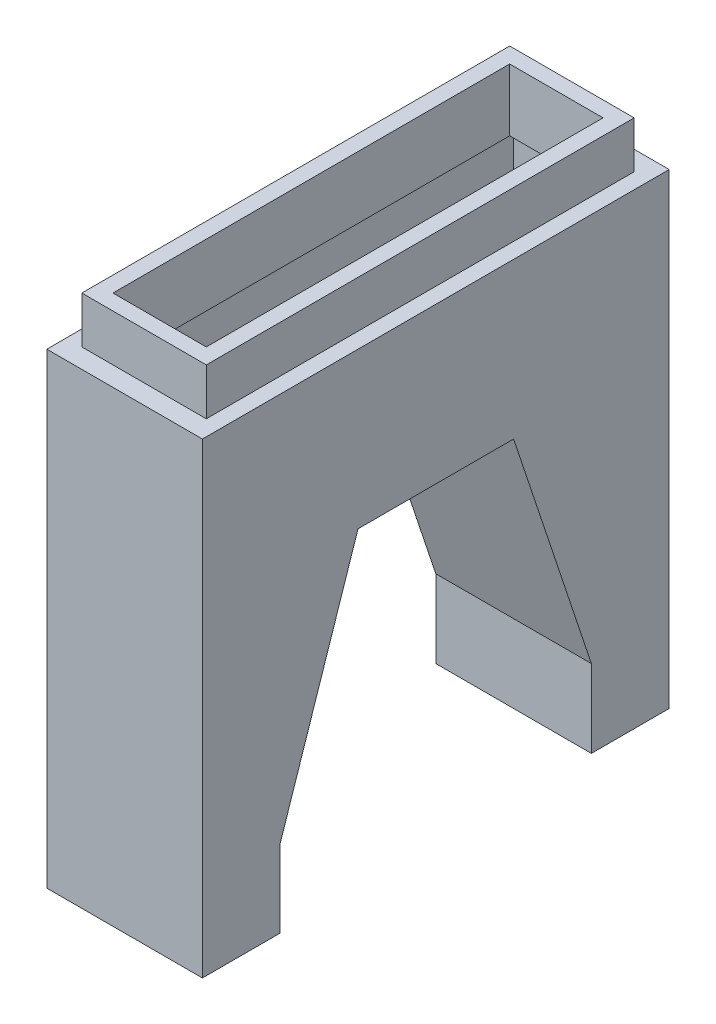
ISO-10303-21;
HEADER;
FILE_DESCRIPTION(('STEP AP214'),'2;1');
FILE_NAME('part.step','',(''),(''),'','','');
FILE_SCHEMA(('AUTOMOTIVE_DESIGN { 1 0 10303 214 1 1 1 1 }'));
ENDSEC;
DATA;
#1=APPLICATION_CONTEXT('core data for automotive mechanical design processes');
#2=APPLICATION_PROTOCOL_DEFINITION('international standard','automotive_design',2000,#1);
#3=PRODUCT_CONTEXT('',#1,'mechanical');
#4=PRODUCT('Part','Part','',(#3));
#5=PRODUCT_RELATED_PRODUCT_CATEGORY('part','',(#4));
#6=PRODUCT_DEFINITION_FORMATION('','',#4);
#7=PRODUCT_DEFINITION_CONTEXT('part definition',#1,'design');
#8=PRODUCT_DEFINITION('design','',#6,#7);
#9=PRODUCT_DEFINITION_SHAPE('','',#8);
#10=(LENGTH_UNIT() NAMED_UNIT(*) SI_UNIT(.MILLI.,.METRE.));
#11=(NAMED_UNIT(*) PLANE_ANGLE_UNIT() SI_UNIT($,.RADIAN.));
#12=(NAMED_UNIT(*) SI_UNIT($,.STERADIAN.) SOLID_ANGLE_UNIT());
#13=UNCERTAINTY_MEASURE_WITH_UNIT(LENGTH_MEASURE(1.E-05),#10,'distance_accuracy_value','');
#14=(GEOMETRIC_REPRESENTATION_CONTEXT(3) GLOBAL_UNCERTAINTY_ASSIGNED_CONTEXT((#13)) GLOBAL_UNIT_ASSIGNED_CONTEXT((#10,
#11,#12)) REPRESENTATION_CONTEXT('',''));
#15=CARTESIAN_POINT('',(0.,0.,0.));
#16=DIRECTION('',(0.,0.,1.));
#17=DIRECTION('',(1.,0.,0.));
#18=AXIS2_PLACEMENT_3D('',#15,#16,#17);
#19=CARTESIAN_POINT('',(0.,3.,0.));
#20=DIRECTION('',(0.,-1.,0.));
#21=DIRECTION('',(0.,0.,-1.));
#22=AXIS2_PLACEMENT_3D('',#19,#20,#21);
#23=PLANE('',#22);
#24=DIRECTION('',(0.,0.,-1.));
#25=VECTOR('',#24,1.);
#26=CARTESIAN_POINT('',(4.,3.,13.75));
#27=LINE('',#26,#25);
#28=CARTESIAN_POINT('',(4.,3.,13.75));
#29=VERTEX_POINT('',#28);
#30=CARTESIAN_POINT('',(4.,3.,-13.75));
#31=VERTEX_POINT('',#30);
#32=EDGE_CURVE('E453',#29,#31,#27,.T.);
#33=ORIENTED_EDGE('',*,*,#32,.T.);
#34=DIRECTION('',(-1.,0.,0.));
#35=VECTOR('',#34,1.);
#36=CARTESIAN_POINT('',(-4.,3.,-13.75));
#37=LINE('',#36,#35);
#38=CARTESIAN_POINT('',(-4.,3.,-13.75));
#39=VERTEX_POINT('',#38);
#40=EDGE_CURVE('E456',#31,#39,#37,.T.);
#41=ORIENTED_EDGE('',*,*,#40,.T.);
#42=DIRECTION('',(0.,0.,1.));
#43=VECTOR('',#42,1.);
#44=CARTESIAN_POINT('',(-4.,3.,13.75));
#45=LINE('',#44,#43);
#46=CARTESIAN_POINT('',(-4.,3.,13.75));
#47=VERTEX_POINT('',#46);
#48=EDGE_CURVE('E459',#39,#47,#45,.T.);
#49=ORIENTED_EDGE('',*,*,#48,.T.);
#50=DIRECTION('',(1.,0.,0.));
#51=VECTOR('',#50,1.);
#52=CARTESIAN_POINT('',(-4.,3.,13.75));
#53=LINE('',#52,#51);
#54=EDGE_CURVE('E461',#47,#29,#53,.T.);
#55=ORIENTED_EDGE('',*,*,#54,.T.);
#56=EDGE_LOOP('',(#33,#41,#49,#55));
#57=FACE_BOUND('',#56,.T.);
#58=DIRECTION('',(0.,0.,-1.));
#59=VECTOR('',#58,1.);
#60=CARTESIAN_POINT('',(3.,3.,0.));
#61=LINE('',#60,#59);
#62=CARTESIAN_POINT('',(3.,3.,12.75));
#63=VERTEX_POINT('',#62);
#64=CARTESIAN_POINT('',(3.,3.,-12.75));
#65=VERTEX_POINT('',#64);
#66=EDGE_CURVE('E333',#63,#65,#61,.T.);
#67=ORIENTED_EDGE('',*,*,#66,.F.);
#68=DIRECTION('',(1.,0.,0.));
#69=VECTOR('',#68,1.);
#70=CARTESIAN_POINT('',(0.,3.,12.75));
#71=LINE('',#70,#69);
#72=CARTESIAN_POINT('',(-3.,3.,12.75));
#73=VERTEX_POINT('',#72);
#74=EDGE_CURVE('E347',#73,#63,#71,.T.);
#75=ORIENTED_EDGE('',*,*,#74,.F.);
#76=DIRECTION('',(0.,0.,1.));
#77=VECTOR('',#76,1.);
#78=CARTESIAN_POINT('',(-3.,3.,0.));
#79=LINE('',#78,#77);
#80=CARTESIAN_POINT('',(-3.,3.,-12.75));
#81=VERTEX_POINT('',#80);
#82=EDGE_CURVE('E372',#81,#73,#79,.T.);
#83=ORIENTED_EDGE('',*,*,#82,.F.);
#84=DIRECTION('',(-1.,0.,0.));
#85=VECTOR('',#84,1.);
#86=CARTESIAN_POINT('',(0.,3.,-12.75));
#87=LINE('',#86,#85);
#88=EDGE_CURVE('E370',#65,#81,#87,.T.);
#89=ORIENTED_EDGE('',*,*,#88,.F.);
#90=EDGE_LOOP('',(#67,#75,#83,#89));
#91=FACE_BOUND('',#90,.T.);
#92=ADVANCED_FACE('F33',(#57,#91),#23,.F.);
#93=CARTESIAN_POINT('',(-1.,-30.,12.));
#94=DIRECTION('',(1.,0.,0.));
#95=DIRECTION('',(0.,0.,-1.));
#96=AXIS2_PLACEMENT_3D('',#93,#94,#95);
#97=PLANE('',#96);
#98=DIRECTION('',(0.,-1.,0.));
#99=VECTOR('',#98,1.);
#100=CARTESIAN_POINT('',(-1.,-30.,11.));
#101=LINE('',#100,#99);
#102=CARTESIAN_POINT('',(-1.,-24.9999999999998,11.));
#103=VERTEX_POINT('',#102);
#104=CARTESIAN_POINT('',(-1.,-29.,11.));
#105=VERTEX_POINT('',#104);
#106=EDGE_CURVE('E11',#103,#105,#101,.T.);
#107=ORIENTED_EDGE('',*,*,#106,.F.);
#108=DIRECTION('',(0.,0.,-1.));
#109=VECTOR('',#108,1.);
#110=CARTESIAN_POINT('',(-1.,-24.9999999999998,12.));
#111=LINE('',#110,#109);
#112=CARTESIAN_POINT('',(-1.,-24.9999999999998,10.));
#113=VERTEX_POINT('',#112);
#114=EDGE_CURVE('E392',#103,#113,#111,.T.);
#115=ORIENTED_EDGE('',*,*,#114,.T.);
#116=DIRECTION('',(0.,-1.,0.));
#117=VECTOR('',#116,1.);
#118=CARTESIAN_POINT('',(-1.,-30.,10.));
#119=LINE('',#118,#117);
#120=CARTESIAN_POINT('',(-1.,-30.,10.));
#121=VERTEX_POINT('',#120);
#122=EDGE_CURVE('E368',#113,#121,#119,.T.);
#123=ORIENTED_EDGE('',*,*,#122,.T.);
#124=DIRECTION('',(0.,0.,-1.));
#125=VECTOR('',#124,1.);
#126=CARTESIAN_POINT('',(-1.,-30.,12.));
#127=LINE('',#126,#125);
#128=CARTESIAN_POINT('',(-1.,-30.,12.));
#129=VERTEX_POINT('',#128);
#130=EDGE_CURVE('E387',#129,#121,#127,.T.);
#131=ORIENTED_EDGE('',*,*,#130,.F.);
#132=DIRECTION('',(0.,-1.,0.));
#133=VECTOR('',#132,1.);
#134=CARTESIAN_POINT('',(-1.,-30.,12.));
#135=LINE('',#134,#133);
#136=CARTESIAN_POINT('',(-1.,-29.,12.));
#137=VERTEX_POINT('',#136);
#138=EDGE_CURVE('E381',#137,#129,#135,.T.);
#139=ORIENTED_EDGE('',*,*,#138,.F.);
#140=DIRECTION('',(0.,0.,-1.));
#141=VECTOR('',#140,1.);
#142=CARTESIAN_POINT('',(-1.,-29.,0.));
#143=LINE('',#142,#141);
#144=EDGE_CURVE('E58',#137,#105,#143,.T.);
#145=ORIENTED_EDGE('',*,*,#144,.T.);
#146=EDGE_LOOP('',(#107,#115,#123,#131,#139,#145));
#147=FACE_BOUND('',#146,.T.);
#148=ADVANCED_FACE('F527',(#147),#97,.F.);
#149=CARTESIAN_POINT('',(-5.,-24.9999999999998,12.));
#150=DIRECTION('',(0.,1.,0.));
#151=DIRECTION('',(0.,0.,1.));
#152=AXIS2_PLACEMENT_3D('',#149,#150,#151);
#153=PLANE('',#152);
#154=DIRECTION('',(1.,0.,0.));
#155=VECTOR('',#154,1.);
#156=CARTESIAN_POINT('',(-5.,-24.9999999999998,11.0540925533895));
#157=LINE('',#156,#155);
#158=CARTESIAN_POINT('',(-4.,-24.9999999999998,11.0540925533895));
#159=VERTEX_POINT('',#158);
#160=CARTESIAN_POINT('',(-1.,-24.9999999999998,11.0540925533895));
#161=VERTEX_POINT('',#160);
#162=EDGE_CURVE('E282',#159,#161,#157,.T.);
#163=ORIENTED_EDGE('',*,*,#162,.F.);
#164=DIRECTION('',(0.,0.,-1.));
#165=VECTOR('',#164,1.);
#166=CARTESIAN_POINT('',(-4.,-24.9999999999998,12.));
#167=LINE('',#166,#165);
#168=CARTESIAN_POINT('',(-4.,-24.9999999999998,12.));
#169=VERTEX_POINT('',#168);
#170=EDGE_CURVE('E356',#169,#159,#167,.T.);
#171=ORIENTED_EDGE('',*,*,#170,.F.);
#172=DIRECTION('',(1.,0.,0.));
#173=VECTOR('',#172,1.);
#174=CARTESIAN_POINT('',(-5.,-24.9999999999998,12.));
#175=LINE('',#174,#173);
#176=CARTESIAN_POINT('',(-5.,-24.9999999999998,12.));
#177=VERTEX_POINT('',#176);
#178=EDGE_CURVE('E378',#177,#169,#175,.T.);
#179=ORIENTED_EDGE('',*,*,#178,.F.);
#180=DIRECTION('',(0.,0.,-1.));
#181=VECTOR('',#180,1.);
#182=CARTESIAN_POINT('',(-5.,-24.9999999999998,12.));
#183=LINE('',#182,#181);
#184=CARTESIAN_POINT('',(-5.,-24.9999999999998,10.));
#185=VERTEX_POINT('',#184);
#186=EDGE_CURVE('E385',#177,#185,#183,.T.);
#187=ORIENTED_EDGE('',*,*,#186,.T.);
#188=DIRECTION('',(1.,0.,0.));
#189=VECTOR('',#188,1.);
#190=CARTESIAN_POINT('',(5.,-24.9999999999998,10.));
#191=LINE('',#190,#189);
#192=EDGE_CURVE('E493',#185,#113,#191,.T.);
#193=ORIENTED_EDGE('',*,*,#192,.T.);
#194=ORIENTED_EDGE('',*,*,#114,.F.);
#195=EDGE_CURVE('E391',#161,#103,#111,.T.);
#196=ORIENTED_EDGE('',*,*,#195,.F.);
#197=EDGE_LOOP('',(#163,#171,#179,#187,#193,#194,#196));
#198=FACE_BOUND('',#197,.T.);
#199=ADVANCED_FACE('F518',(#198),#153,.F.);
#200=CARTESIAN_POINT('',(0.,-10.,0.));
#201=DIRECTION('',(0.,-1.,0.));
#202=DIRECTION('',(0.,0.,-1.));
#203=AXIS2_PLACEMENT_3D('',#200,#201,#202);
#204=PLANE('',#203);
#205=DIRECTION('',(0.,0.,-1.));
#206=VECTOR('',#205,1.);
#207=CARTESIAN_POINT('',(-5.,-10.,15.));
#208=LINE('',#207,#206);
#209=CARTESIAN_POINT('',(-5.,-10.,5.));
#210=VERTEX_POINT('',#209);
#211=CARTESIAN_POINT('',(-5.,-10.,-5.));
#212=VERTEX_POINT('',#211);
#213=EDGE_CURVE('E429',#210,#212,#208,.T.);
#214=ORIENTED_EDGE('',*,*,#213,.T.);
#215=DIRECTION('',(1.,0.,0.));
#216=VECTOR('',#215,1.);
#217=CARTESIAN_POINT('',(0.,-10.,-5.));
#218=LINE('',#217,#216);
#219=CARTESIAN_POINT('',(5.,-10.,-5.));
#220=VERTEX_POINT('',#219);
#221=EDGE_CURVE('E490',#212,#220,#218,.T.);
#222=ORIENTED_EDGE('',*,*,#221,.T.);
#223=DIRECTION('',(0.,0.,1.));
#224=VECTOR('',#223,1.);
#225=CARTESIAN_POINT('',(5.,-10.,15.));
#226=LINE('',#225,#224);
#227=CARTESIAN_POINT('',(5.,-10.,5.));
#228=VERTEX_POINT('',#227);
#229=EDGE_CURVE('E426',#220,#228,#226,.T.);
#230=ORIENTED_EDGE('',*,*,#229,.T.);
#231=DIRECTION('',(-1.,0.,0.));
#232=VECTOR('',#231,1.);
#233=CARTESIAN_POINT('',(0.,-10.,5.));
#234=LINE('',#233,#232);
#235=EDGE_CURVE('E488',#228,#210,#234,.T.);
#236=ORIENTED_EDGE('',*,*,#235,.T.);
#237=EDGE_LOOP('',(#214,#222,#230,#236));
#238=FACE_BOUND('',#237,.T.);
#239=ADVANCED_FACE('F561',(#238),#204,.T.);
#240=CARTESIAN_POINT('',(4.,3.,13.75));
#241=DIRECTION('',(-1.,0.,0.));
#242=DIRECTION('',(0.,0.,1.));
#243=AXIS2_PLACEMENT_3D('',#240,#241,#242);
#244=PLANE('',#243);
#245=DIRECTION('',(0.,0.,-1.));
#246=VECTOR('',#245,1.);
#247=CARTESIAN_POINT('',(4.,0.,13.75));
#248=LINE('',#247,#246);
#249=CARTESIAN_POINT('',(4.,0.,13.75));
#250=VERTEX_POINT('',#249);
#251=CARTESIAN_POINT('',(4.,0.,-13.75));
#252=VERTEX_POINT('',#251);
#253=EDGE_CURVE('E452',#250,#252,#248,.T.);
#254=ORIENTED_EDGE('',*,*,#253,.T.);
#255=DIRECTION('',(0.,-1.,0.));
#256=VECTOR('',#255,1.);
#257=CARTESIAN_POINT('',(4.,3.,-13.75));
#258=LINE('',#257,#256);
#259=EDGE_CURVE('E482',#31,#252,#258,.T.);
#260=ORIENTED_EDGE('',*,*,#259,.F.);
#261=ORIENTED_EDGE('',*,*,#32,.F.);
#262=DIRECTION('',(0.,-1.,0.));
#263=VECTOR('',#262,1.);
#264=CARTESIAN_POINT('',(4.,3.,13.75));
#265=LINE('',#264,#263);
#266=EDGE_CURVE('E463',#29,#250,#265,.T.);
#267=ORIENTED_EDGE('',*,*,#266,.T.);
#268=EDGE_LOOP('',(#254,#260,#261,#267));
#269=FACE_BOUND('',#268,.T.);
#270=ADVANCED_FACE('F592',(#269),#244,.F.);
#271=CARTESIAN_POINT('',(-4.,3.,-13.75));
#272=DIRECTION('',(0.,0.,1.));
#273=DIRECTION('',(1.,0.,0.));
#274=AXIS2_PLACEMENT_3D('',#271,#272,#273);
#275=PLANE('',#274);
#276=DIRECTION('',(-1.,0.,0.));
#277=VECTOR('',#276,1.);
#278=CARTESIAN_POINT('',(-4.,0.,-13.75));
#279=LINE('',#278,#277);
#280=CARTESIAN_POINT('',(-4.,0.,-13.75));
#281=VERTEX_POINT('',#280);
#282=EDGE_CURVE('E466',#252,#281,#279,.T.);
#283=ORIENTED_EDGE('',*,*,#282,.T.);
#284=DIRECTION('',(0.,-1.,0.));
#285=VECTOR('',#284,1.);
#286=CARTESIAN_POINT('',(-4.,3.,-13.75));
#287=LINE('',#286,#285);
#288=EDGE_CURVE('E479',#39,#281,#287,.T.);
#289=ORIENTED_EDGE('',*,*,#288,.F.);
#290=ORIENTED_EDGE('',*,*,#40,.F.);
#291=ORIENTED_EDGE('',*,*,#259,.T.);
#292=EDGE_LOOP('',(#283,#289,#290,#291));
#293=FACE_BOUND('',#292,.T.);
#294=ADVANCED_FACE('F588',(#293),#275,.F.);
#295=CARTESIAN_POINT('',(-4.,3.,13.75));
#296=DIRECTION('',(1.,0.,0.));
#297=DIRECTION('',(0.,0.,-1.));
#298=AXIS2_PLACEMENT_3D('',#295,#296,#297);
#299=PLANE('',#298);
#300=DIRECTION('',(0.,0.,1.));
#301=VECTOR('',#300,1.);
#302=CARTESIAN_POINT('',(-4.,0.,13.75));
#303=LINE('',#302,#301);
#304=CARTESIAN_POINT('',(-4.,0.,13.75));
#305=VERTEX_POINT('',#304);
#306=EDGE_CURVE('E469',#281,#305,#303,.T.);
#307=ORIENTED_EDGE('',*,*,#306,.T.);
#308=DIRECTION('',(0.,-1.,0.));
#309=VECTOR('',#308,1.);
#310=CARTESIAN_POINT('',(-4.,3.,13.75));
#311=LINE('',#310,#309);
#312=EDGE_CURVE('E476',#47,#305,#311,.T.);
#313=ORIENTED_EDGE('',*,*,#312,.F.);
#314=ORIENTED_EDGE('',*,*,#48,.F.);
#315=ORIENTED_EDGE('',*,*,#288,.T.);
#316=EDGE_LOOP('',(#307,#313,#314,#315));
#317=FACE_BOUND('',#316,.T.);
#318=ADVANCED_FACE('F584',(#317),#299,.F.);
#319=CARTESIAN_POINT('',(-4.,3.,13.75));
#320=DIRECTION('',(0.,0.,-1.));
#321=DIRECTION('',(-1.,0.,0.));
#322=AXIS2_PLACEMENT_3D('',#319,#320,#321);
#323=PLANE('',#322);
#324=DIRECTION('',(1.,0.,0.));
#325=VECTOR('',#324,1.);
#326=CARTESIAN_POINT('',(-4.,0.,13.75));
#327=LINE('',#326,#325);
#328=EDGE_CURVE('E457',#305,#250,#327,.T.);
#329=ORIENTED_EDGE('',*,*,#328,.T.);
#330=ORIENTED_EDGE('',*,*,#266,.F.);
#331=ORIENTED_EDGE('',*,*,#54,.F.);
#332=ORIENTED_EDGE('',*,*,#312,.T.);
#333=EDGE_LOOP('',(#329,#330,#331,#332));
#334=FACE_BOUND('',#333,.T.);
#335=ADVANCED_FACE('F571',(#334),#323,.F.);
#336=CARTESIAN_POINT('',(5.,-10.,15.));
#337=DIRECTION('',(-1.,0.,0.));
#338=DIRECTION('',(0.,0.,1.));
#339=AXIS2_PLACEMENT_3D('',#336,#337,#338);
#340=PLANE('',#339);
#341=DIRECTION('',(0.,0.,1.));
#342=VECTOR('',#341,1.);
#343=CARTESIAN_POINT('',(5.,0.,15.));
#344=LINE('',#343,#342);
#345=CARTESIAN_POINT('',(5.,0.,-15.));
#346=VERTEX_POINT('',#345);
#347=CARTESIAN_POINT('',(5.,0.,15.));
#348=VERTEX_POINT('',#347);
#349=EDGE_CURVE('E425',#346,#348,#344,.T.);
#350=ORIENTED_EDGE('',*,*,#349,.T.);
#351=DIRECTION('',(0.,1.,0.));
#352=VECTOR('',#351,1.);
#353=CARTESIAN_POINT('',(5.,-10.,15.));
#354=LINE('',#353,#352);
#355=CARTESIAN_POINT('',(5.,-30.,15.));
#356=VERTEX_POINT('',#355);
#357=EDGE_CURVE('E449',#356,#348,#354,.T.);
#358=ORIENTED_EDGE('',*,*,#357,.F.);
#359=DIRECTION('',(0.,0.,1.));
#360=VECTOR('',#359,1.);
#361=CARTESIAN_POINT('',(5.,-30.,15.));
#362=LINE('',#361,#360);
#363=CARTESIAN_POINT('',(5.,-30.,10.));
#364=VERTEX_POINT('',#363);
#365=EDGE_CURVE('E411',#364,#356,#362,.T.);
#366=ORIENTED_EDGE('',*,*,#365,.F.);
#367=DIRECTION('',(0.,1.,0.));
#368=VECTOR('',#367,1.);
#369=CARTESIAN_POINT('',(5.,-30.,10.));
#370=LINE('',#369,#368);
#371=CARTESIAN_POINT('',(5.,-24.9999999999998,10.));
#372=VERTEX_POINT('',#371);
#373=EDGE_CURVE('E422',#364,#372,#370,.T.);
#374=ORIENTED_EDGE('',*,*,#373,.T.);
#375=DIRECTION('',(0.,0.948683298050513,-0.316227766016841));
#376=VECTOR('',#375,1.);
#377=CARTESIAN_POINT('',(5.,-13.,6.00000000000002));
#378=LINE('',#377,#376);
#379=EDGE_CURVE('E499',#372,#228,#378,.T.);
#380=ORIENTED_EDGE('',*,*,#379,.T.);
#381=ORIENTED_EDGE('',*,*,#229,.F.);
#382=DIRECTION('',(0.,-0.948683298050513,-0.316227766016841));
#383=VECTOR('',#382,1.);
#384=CARTESIAN_POINT('',(5.,-3.99999999999996,-2.99999999999997));
#385=LINE('',#384,#383);
#386=CARTESIAN_POINT('',(5.,-24.9999999999998,-10.));
#387=VERTEX_POINT('',#386);
#388=EDGE_CURVE('E498',#220,#387,#385,.T.);
#389=ORIENTED_EDGE('',*,*,#388,.T.);
#390=DIRECTION('',(0.,1.,0.));
#391=VECTOR('',#390,1.);
#392=CARTESIAN_POINT('',(5.,-30.,-10.));
#393=LINE('',#392,#391);
#394=CARTESIAN_POINT('',(5.,-30.,-10.));
#395=VERTEX_POINT('',#394);
#396=EDGE_CURVE('E408',#395,#387,#393,.T.);
#397=ORIENTED_EDGE('',*,*,#396,.F.);
#398=DIRECTION('',(0.,0.,1.));
#399=VECTOR('',#398,1.);
#400=CARTESIAN_POINT('',(5.,-30.,-15.));
#401=LINE('',#400,#399);
#402=CARTESIAN_POINT('',(5.,-30.,-15.));
#403=VERTEX_POINT('',#402);
#404=EDGE_CURVE('E390',#403,#395,#401,.T.);
#405=ORIENTED_EDGE('',*,*,#404,.F.);
#406=DIRECTION('',(0.,1.,0.));
#407=VECTOR('',#406,1.);
#408=CARTESIAN_POINT('',(5.,-10.,-15.));
#409=LINE('',#408,#407);
#410=EDGE_CURVE('E433',#403,#346,#409,.T.);
#411=ORIENTED_EDGE('',*,*,#410,.T.);
#412=EDGE_LOOP('',(#350,#358,#366,#374,#380,#381,#389,#397,#405,#411));
#413=FACE_BOUND('',#412,.T.);
#414=ADVANCED_FACE('F547',(#413),#340,.F.);
#415=CARTESIAN_POINT('',(-5.,-10.,15.));
#416=DIRECTION('',(0.,0.,-1.));
#417=DIRECTION('',(-1.,0.,0.));
#418=AXIS2_PLACEMENT_3D('',#415,#416,#417);
#419=PLANE('',#418);
#420=DIRECTION('',(-1.,0.,0.));
#421=VECTOR('',#420,1.);
#422=CARTESIAN_POINT('',(-5.,0.,15.));
#423=LINE('',#422,#421);
#424=CARTESIAN_POINT('',(-5.,0.,15.));
#425=VERTEX_POINT('',#424);
#426=EDGE_CURVE('E436',#348,#425,#423,.T.);
#427=ORIENTED_EDGE('',*,*,#426,.T.);
#428=DIRECTION('',(0.,1.,0.));
#429=VECTOR('',#428,1.);
#430=CARTESIAN_POINT('',(-5.,-10.,15.));
#431=LINE('',#430,#429);
#432=CARTESIAN_POINT('',(-5.,-30.,15.));
#433=VERTEX_POINT('',#432);
#434=EDGE_CURVE('E446',#433,#425,#431,.T.);
#435=ORIENTED_EDGE('',*,*,#434,.F.);
#436=DIRECTION('',(-1.,0.,0.));
#437=VECTOR('',#436,1.);
#438=CARTESIAN_POINT('',(5.,-30.,15.));
#439=LINE('',#438,#437);
#440=EDGE_CURVE('E414',#356,#433,#439,.T.);
#441=ORIENTED_EDGE('',*,*,#440,.F.);
#442=ORIENTED_EDGE('',*,*,#357,.T.);
#443=EDGE_LOOP('',(#427,#435,#441,#442));
#444=FACE_BOUND('',#443,.T.);
#445=ADVANCED_FACE('F563',(#444),#419,.F.);
#446=CARTESIAN_POINT('',(-5.,-10.,15.));
#447=DIRECTION('',(1.,0.,0.));
#448=DIRECTION('',(0.,0.,-1.));
#449=AXIS2_PLACEMENT_3D('',#446,#447,#448);
#450=PLANE('',#449);
#451=DIRECTION('',(0.,-0.948683298050513,0.316227766016841));
#452=VECTOR('',#451,1.);
#453=CARTESIAN_POINT('',(-5.,-13.,6.00000000000002));
#454=LINE('',#453,#452);
#455=EDGE_CURVE('E37',#210,#185,#454,.T.);
#456=ORIENTED_EDGE('',*,*,#455,.T.);
#457=ORIENTED_EDGE('',*,*,#186,.F.);
#458=DIRECTION('',(0.,1.,0.));
#459=VECTOR('',#458,1.);
#460=CARTESIAN_POINT('',(-5.,-30.,12.));
#461=LINE('',#460,#459);
#462=CARTESIAN_POINT('',(-5.,-30.,12.));
#463=VERTEX_POINT('',#462);
#464=EDGE_CURVE('E375',#463,#177,#461,.T.);
#465=ORIENTED_EDGE('',*,*,#464,.F.);
#466=DIRECTION('',(0.,0.,-1.));
#467=VECTOR('',#466,1.);
#468=CARTESIAN_POINT('',(-5.,-30.,15.));
#469=LINE('',#468,#467);
#470=EDGE_CURVE('E417',#433,#463,#469,.T.);
#471=ORIENTED_EDGE('',*,*,#470,.F.);
#472=ORIENTED_EDGE('',*,*,#434,.T.);
#473=DIRECTION('',(0.,0.,-1.));
#474=VECTOR('',#473,1.);
#475=CARTESIAN_POINT('',(-5.,0.,15.));
#476=LINE('',#475,#474);
#477=CARTESIAN_POINT('',(-5.,0.,-15.));
#478=VERTEX_POINT('',#477);
#479=EDGE_CURVE('E438',#425,#478,#476,.T.);
#480=ORIENTED_EDGE('',*,*,#479,.T.);
#481=DIRECTION('',(0.,1.,0.));
#482=VECTOR('',#481,1.);
#483=CARTESIAN_POINT('',(-5.,-10.,-15.));
#484=LINE('',#483,#482);
#485=CARTESIAN_POINT('',(-5.,-30.,-15.));
#486=VERTEX_POINT('',#485);
#487=EDGE_CURVE('E443',#486,#478,#484,.T.);
#488=ORIENTED_EDGE('',*,*,#487,.F.);
#489=DIRECTION('',(0.,0.,-1.));
#490=VECTOR('',#489,1.);
#491=CARTESIAN_POINT('',(-5.,-30.,-15.));
#492=LINE('',#491,#490);
#493=CARTESIAN_POINT('',(-5.,-30.,-10.));
#494=VERTEX_POINT('',#493);
#495=EDGE_CURVE('E399',#494,#486,#492,.T.);
#496=ORIENTED_EDGE('',*,*,#495,.F.);
#497=DIRECTION('',(0.,1.,0.));
#498=VECTOR('',#497,1.);
#499=CARTESIAN_POINT('',(-5.,-30.,-10.));
#500=LINE('',#499,#498);
#501=CARTESIAN_POINT('',(-5.,-24.9999999999998,-10.));
#502=VERTEX_POINT('',#501);
#503=EDGE_CURVE('E405',#494,#502,#500,.T.);
#504=ORIENTED_EDGE('',*,*,#503,.T.);
#505=DIRECTION('',(0.,0.948683298050513,0.316227766016841));
#506=VECTOR('',#505,1.);
#507=CARTESIAN_POINT('',(-5.,-3.99999999999996,-2.99999999999997));
#508=LINE('',#507,#506);
#509=EDGE_CURVE('E496',#502,#212,#508,.T.);
#510=ORIENTED_EDGE('',*,*,#509,.T.);
#511=ORIENTED_EDGE('',*,*,#213,.F.);
#512=EDGE_LOOP('',(#456,#457,#465,#471,#472,#480,#488,#496,#504,#510,#511));
#513=FACE_BOUND('',#512,.T.);
#514=ADVANCED_FACE('F509',(#513),#450,.F.);
#515=CARTESIAN_POINT('',(-5.,-10.,-15.));
#516=DIRECTION('',(0.,0.,1.));
#517=DIRECTION('',(1.,0.,0.));
#518=AXIS2_PLACEMENT_3D('',#515,#516,#517);
#519=PLANE('',#518);
#520=DIRECTION('',(1.,0.,0.));
#521=VECTOR('',#520,1.);
#522=CARTESIAN_POINT('',(-5.,0.,-15.));
#523=LINE('',#522,#521);
#524=EDGE_CURVE('E430',#478,#346,#523,.T.);
#525=ORIENTED_EDGE('',*,*,#524,.T.);
#526=ORIENTED_EDGE('',*,*,#410,.F.);
#527=DIRECTION('',(1.,0.,0.));
#528=VECTOR('',#527,1.);
#529=CARTESIAN_POINT('',(5.,-30.,-15.));
#530=LINE('',#529,#528);
#531=EDGE_CURVE('E402',#486,#403,#530,.T.);
#532=ORIENTED_EDGE('',*,*,#531,.F.);
#533=ORIENTED_EDGE('',*,*,#487,.T.);
#534=EDGE_LOOP('',(#525,#526,#532,#533));
#535=FACE_BOUND('',#534,.T.);
#536=ADVANCED_FACE('F544',(#535),#519,.F.);
#537=CARTESIAN_POINT('',(0.,0.,0.));
#538=DIRECTION('',(0.,-1.,0.));
#539=DIRECTION('',(0.,0.,-1.));
#540=AXIS2_PLACEMENT_3D('',#537,#538,#539);
#541=PLANE('',#540);
#542=ORIENTED_EDGE('',*,*,#253,.F.);
#543=ORIENTED_EDGE('',*,*,#328,.F.);
#544=ORIENTED_EDGE('',*,*,#306,.F.);
#545=ORIENTED_EDGE('',*,*,#282,.F.);
#546=EDGE_LOOP('',(#542,#543,#544,#545));
#547=FACE_BOUND('',#546,.T.);
#548=ORIENTED_EDGE('',*,*,#349,.F.);
#549=ORIENTED_EDGE('',*,*,#524,.F.);
#550=ORIENTED_EDGE('',*,*,#479,.F.);
#551=ORIENTED_EDGE('',*,*,#426,.F.);
#552=EDGE_LOOP('',(#548,#549,#550,#551));
#553=FACE_BOUND('',#552,.T.);
#554=ADVANCED_FACE('F542',(#547,#553),#541,.F.);
#555=CARTESIAN_POINT('',(5.,-30.,10.));
#556=DIRECTION('',(0.,0.,1.));
#557=DIRECTION('',(1.,0.,0.));
#558=AXIS2_PLACEMENT_3D('',#555,#556,#557);
#559=PLANE('',#558);
#560=DIRECTION('',(1.,0.,0.));
#561=VECTOR('',#560,1.);
#562=CARTESIAN_POINT('',(5.,-30.,10.));
#563=LINE('',#562,#561);
#564=EDGE_CURVE('E420',#121,#364,#563,.T.);
#565=ORIENTED_EDGE('',*,*,#564,.F.);
#566=ORIENTED_EDGE('',*,*,#122,.F.);
#567=EDGE_CURVE('E492',#113,#372,#191,.T.);
#568=ORIENTED_EDGE('',*,*,#567,.T.);
#569=ORIENTED_EDGE('',*,*,#373,.F.);
#570=EDGE_LOOP('',(#565,#566,#568,#569));
#571=FACE_BOUND('',#570,.T.);
#572=ADVANCED_FACE('F522',(#571),#559,.F.);
#573=CARTESIAN_POINT('',(0.,-30.,0.));
#574=DIRECTION('',(0.,1.,0.));
#575=DIRECTION('',(0.,0.,1.));
#576=AXIS2_PLACEMENT_3D('',#573,#574,#575);
#577=PLANE('',#576);
#578=DIRECTION('',(-1.,0.,0.));
#579=VECTOR('',#578,1.);
#580=CARTESIAN_POINT('',(-5.,-30.,12.));
#581=LINE('',#580,#579);
#582=EDGE_CURVE('E383',#129,#463,#581,.T.);
#583=ORIENTED_EDGE('',*,*,#582,.F.);
#584=ORIENTED_EDGE('',*,*,#130,.T.);
#585=ORIENTED_EDGE('',*,*,#564,.T.);
#586=ORIENTED_EDGE('',*,*,#365,.T.);
#587=ORIENTED_EDGE('',*,*,#440,.T.);
#588=ORIENTED_EDGE('',*,*,#470,.T.);
#589=EDGE_LOOP('',(#583,#584,#585,#586,#587,#588));
#590=FACE_BOUND('',#589,.T.);
#591=ADVANCED_FACE('F531',(#590),#577,.F.);
#592=CARTESIAN_POINT('',(5.,-30.,-10.));
#593=DIRECTION('',(0.,0.,-1.));
#594=DIRECTION('',(-1.,0.,0.));
#595=AXIS2_PLACEMENT_3D('',#592,#593,#594);
#596=PLANE('',#595);
#597=ORIENTED_EDGE('',*,*,#396,.T.);
#598=DIRECTION('',(-1.,0.,0.));
#599=VECTOR('',#598,1.);
#600=CARTESIAN_POINT('',(5.,-24.9999999999998,-10.));
#601=LINE('',#600,#599);
#602=EDGE_CURVE('E485',#387,#502,#601,.T.);
#603=ORIENTED_EDGE('',*,*,#602,.T.);
#604=ORIENTED_EDGE('',*,*,#503,.F.);
#605=DIRECTION('',(-1.,0.,0.));
#606=VECTOR('',#605,1.);
#607=CARTESIAN_POINT('',(5.,-30.,-10.));
#608=LINE('',#607,#606);
#609=EDGE_CURVE('E397',#395,#494,#608,.T.);
#610=ORIENTED_EDGE('',*,*,#609,.F.);
#611=EDGE_LOOP('',(#597,#603,#604,#610));
#612=FACE_BOUND('',#611,.T.);
#613=ADVANCED_FACE('F554',(#612),#596,.F.);
#614=CARTESIAN_POINT('',(0.,-30.,0.));
#615=DIRECTION('',(0.,-1.,0.));
#616=DIRECTION('',(0.,0.,-1.));
#617=AXIS2_PLACEMENT_3D('',#614,#615,#616);
#618=PLANE('',#617);
#619=ORIENTED_EDGE('',*,*,#404,.T.);
#620=ORIENTED_EDGE('',*,*,#609,.T.);
#621=ORIENTED_EDGE('',*,*,#495,.T.);
#622=ORIENTED_EDGE('',*,*,#531,.T.);
#623=EDGE_LOOP('',(#619,#620,#621,#622));
#624=FACE_BOUND('',#623,.T.);
#625=ADVANCED_FACE('F550',(#624),#618,.T.);
#626=CARTESIAN_POINT('',(5.,-24.9999999999998,-10.));
#627=DIRECTION('',(0.,0.316227766016841,-0.948683298050513));
#628=DIRECTION('',(-1.,0.,0.));
#629=AXIS2_PLACEMENT_3D('',#626,#627,#628);
#630=PLANE('',#629);
#631=ORIENTED_EDGE('',*,*,#388,.F.);
#632=ORIENTED_EDGE('',*,*,#221,.F.);
#633=ORIENTED_EDGE('',*,*,#509,.F.);
#634=ORIENTED_EDGE('',*,*,#602,.F.);
#635=EDGE_LOOP('',(#631,#632,#633,#634));
#636=FACE_BOUND('',#635,.T.);
#637=ADVANCED_FACE('F558',(#636),#630,.F.);
#638=CARTESIAN_POINT('',(5.,-24.9999999999998,10.));
#639=DIRECTION('',(0.,0.316227766016841,0.948683298050513));
#640=DIRECTION('',(1.,0.,0.));
#641=AXIS2_PLACEMENT_3D('',#638,#639,#640);
#642=PLANE('',#641);
#643=ORIENTED_EDGE('',*,*,#455,.F.);
#644=ORIENTED_EDGE('',*,*,#235,.F.);
#645=ORIENTED_EDGE('',*,*,#379,.F.);
#646=ORIENTED_EDGE('',*,*,#567,.F.);
#647=ORIENTED_EDGE('',*,*,#192,.F.);
#648=EDGE_LOOP('',(#643,#644,#645,#646,#647));
#649=FACE_BOUND('',#648,.T.);
#650=ADVANCED_FACE('F35',(#649),#642,.F.);
#651=CARTESIAN_POINT('',(0.,0.,12.));
#652=DIRECTION('',(0.,0.,-1.));
#653=DIRECTION('',(-1.,0.,0.));
#654=AXIS2_PLACEMENT_3D('',#651,#652,#653);
#655=PLANE('',#654);
#656=DIRECTION('',(0.,1.,0.));
#657=VECTOR('',#656,1.);
#658=CARTESIAN_POINT('',(-4.,-10.,12.));
#659=LINE('',#658,#657);
#660=CARTESIAN_POINT('',(-4.,-29.,12.));
#661=VERTEX_POINT('',#660);
#662=EDGE_CURVE('E362',#661,#169,#659,.T.);
#663=ORIENTED_EDGE('',*,*,#662,.F.);
#664=DIRECTION('',(-1.,0.,0.));
#665=VECTOR('',#664,1.);
#666=CARTESIAN_POINT('',(0.,-29.,12.));
#667=LINE('',#666,#665);
#668=EDGE_CURVE('E358',#137,#661,#667,.T.);
#669=ORIENTED_EDGE('',*,*,#668,.F.);
#670=ORIENTED_EDGE('',*,*,#138,.T.);
#671=ORIENTED_EDGE('',*,*,#582,.T.);
#672=ORIENTED_EDGE('',*,*,#464,.T.);
#673=ORIENTED_EDGE('',*,*,#178,.T.);
#674=EDGE_LOOP('',(#663,#669,#670,#671,#672,#673));
#675=FACE_BOUND('',#674,.T.);
#676=ADVANCED_FACE('F535',(#675),#655,.T.);
#677=CARTESIAN_POINT('',(-1.,-30.,12.));
#678=DIRECTION('',(1.,0.,0.));
#679=DIRECTION('',(0.,0.,-1.));
#680=AXIS2_PLACEMENT_3D('',#677,#678,#679);
#681=PLANE('',#680);
#682=ORIENTED_EDGE('',*,*,#195,.T.);
#683=CARTESIAN_POINT('',(-1.,-24.8377223398315,11.));
#684=VERTEX_POINT('',#683);
#685=EDGE_CURVE('E43',#684,#103,#101,.T.);
#686=ORIENTED_EDGE('',*,*,#685,.F.);
#687=DIRECTION('',(0.,0.948683298050513,-0.316227766016841));
#688=VECTOR('',#687,1.);
#689=CARTESIAN_POINT('',(-1.,-24.683772233983,10.9486832980505));
#690=LINE('',#689,#688);
#691=EDGE_CURVE('E310',#161,#684,#690,.T.);
#692=ORIENTED_EDGE('',*,*,#691,.F.);
#693=EDGE_LOOP('',(#682,#686,#692));
#694=FACE_BOUND('',#693,.T.);
#695=ADVANCED_FACE('F744',(#694),#681,.T.);
#696=CARTESIAN_POINT('',(0.,-9.,0.));
#697=DIRECTION('',(0.,-1.,0.));
#698=DIRECTION('',(0.,0.,-1.));
#699=AXIS2_PLACEMENT_3D('',#696,#697,#698);
#700=PLANE('',#699);
#701=DIRECTION('',(0.,0.,-1.));
#702=VECTOR('',#701,1.);
#703=CARTESIAN_POINT('',(-4.,-9.,15.));
#704=LINE('',#703,#702);
#705=CARTESIAN_POINT('',(-4.,-9.,5.72075922005613));
#706=VERTEX_POINT('',#705);
#707=CARTESIAN_POINT('',(-4.,-9.,-5.72075922005613));
#708=VERTEX_POINT('',#707);
#709=EDGE_CURVE('E269',#706,#708,#704,.T.);
#710=ORIENTED_EDGE('',*,*,#709,.F.);
#711=DIRECTION('',(-1.,0.,0.));
#712=VECTOR('',#711,1.);
#713=CARTESIAN_POINT('',(0.,-9.,5.72075922005613));
#714=LINE('',#713,#712);
#715=CARTESIAN_POINT('',(4.,-9.,5.72075922005613));
#716=VERTEX_POINT('',#715);
#717=EDGE_CURVE('E261',#716,#706,#714,.T.);
#718=ORIENTED_EDGE('',*,*,#717,.F.);
#719=DIRECTION('',(0.,0.,1.));
#720=VECTOR('',#719,1.);
#721=CARTESIAN_POINT('',(4.,-9.,15.));
#722=LINE('',#721,#720);
#723=CARTESIAN_POINT('',(4.,-9.,-5.72075922005613));
#724=VERTEX_POINT('',#723);
#725=EDGE_CURVE('E265',#724,#716,#722,.T.);
#726=ORIENTED_EDGE('',*,*,#725,.F.);
#727=DIRECTION('',(1.,0.,0.));
#728=VECTOR('',#727,1.);
#729=CARTESIAN_POINT('',(0.,-9.,-5.72075922005613));
#730=LINE('',#729,#728);
#731=EDGE_CURVE('E249',#708,#724,#730,.T.);
#732=ORIENTED_EDGE('',*,*,#731,.F.);
#733=EDGE_LOOP('',(#710,#718,#726,#732));
#734=FACE_BOUND('',#733,.T.);
#735=ADVANCED_FACE('F266',(#734),#700,.F.);
#736=CARTESIAN_POINT('',(3.,3.,13.75));
#737=DIRECTION('',(-1.,0.,0.));
#738=DIRECTION('',(0.,0.,1.));
#739=AXIS2_PLACEMENT_3D('',#736,#737,#738);
#740=PLANE('',#739);
#741=DIRECTION('',(0.,0.,-1.));
#742=VECTOR('',#741,1.);
#743=CARTESIAN_POINT('',(3.,-1.,0.));
#744=LINE('',#743,#742);
#745=CARTESIAN_POINT('',(3.,-1.,12.75));
#746=VERTEX_POINT('',#745);
#747=CARTESIAN_POINT('',(3.,-1.,-12.75));
#748=VERTEX_POINT('',#747);
#749=EDGE_CURVE('E326',#746,#748,#744,.T.);
#750=ORIENTED_EDGE('',*,*,#749,.F.);
#751=DIRECTION('',(0.,-1.,0.));
#752=VECTOR('',#751,1.);
#753=CARTESIAN_POINT('',(3.,3.,12.75));
#754=LINE('',#753,#752);
#755=EDGE_CURVE('E344',#63,#746,#754,.T.);
#756=ORIENTED_EDGE('',*,*,#755,.F.);
#757=ORIENTED_EDGE('',*,*,#66,.T.);
#758=DIRECTION('',(0.,-1.,0.));
#759=VECTOR('',#758,1.);
#760=CARTESIAN_POINT('',(3.,3.,-12.75));
#761=LINE('',#760,#759);
#762=EDGE_CURVE('E339',#65,#748,#761,.T.);
#763=ORIENTED_EDGE('',*,*,#762,.T.);
#764=EDGE_LOOP('',(#750,#756,#757,#763));
#765=FACE_BOUND('',#764,.T.);
#766=ADVANCED_FACE('F756',(#765),#740,.T.);
#767=CARTESIAN_POINT('',(-4.,3.,-12.75));
#768=DIRECTION('',(0.,0.,1.));
#769=DIRECTION('',(1.,0.,0.));
#770=AXIS2_PLACEMENT_3D('',#767,#768,#769);
#771=PLANE('',#770);
#772=DIRECTION('',(-1.,0.,0.));
#773=VECTOR('',#772,1.);
#774=CARTESIAN_POINT('',(0.,-1.,-12.75));
#775=LINE('',#774,#773);
#776=CARTESIAN_POINT('',(-3.,-1.,-12.75));
#777=VERTEX_POINT('',#776);
#778=EDGE_CURVE('E329',#748,#777,#775,.T.);
#779=ORIENTED_EDGE('',*,*,#778,.F.);
#780=ORIENTED_EDGE('',*,*,#762,.F.);
#781=ORIENTED_EDGE('',*,*,#88,.T.);
#782=DIRECTION('',(0.,-1.,0.));
#783=VECTOR('',#782,1.);
#784=CARTESIAN_POINT('',(-3.,3.,-12.75));
#785=LINE('',#784,#783);
#786=EDGE_CURVE('E343',#81,#777,#785,.T.);
#787=ORIENTED_EDGE('',*,*,#786,.T.);
#788=EDGE_LOOP('',(#779,#780,#781,#787));
#789=FACE_BOUND('',#788,.T.);
#790=ADVANCED_FACE('F763',(#789),#771,.T.);
#791=CARTESIAN_POINT('',(-3.,3.,13.75));
#792=DIRECTION('',(1.,0.,0.));
#793=DIRECTION('',(0.,0.,-1.));
#794=AXIS2_PLACEMENT_3D('',#791,#792,#793);
#795=PLANE('',#794);
#796=DIRECTION('',(0.,0.,1.));
#797=VECTOR('',#796,1.);
#798=CARTESIAN_POINT('',(-3.,-1.,0.));
#799=LINE('',#798,#797);
#800=CARTESIAN_POINT('',(-3.,-1.,12.75));
#801=VERTEX_POINT('',#800);
#802=EDGE_CURVE('E334',#777,#801,#799,.T.);
#803=ORIENTED_EDGE('',*,*,#802,.F.);
#804=ORIENTED_EDGE('',*,*,#786,.F.);
#805=ORIENTED_EDGE('',*,*,#82,.T.);
#806=DIRECTION('',(0.,-1.,0.));
#807=VECTOR('',#806,1.);
#808=CARTESIAN_POINT('',(-3.,3.,12.75));
#809=LINE('',#808,#807);
#810=EDGE_CURVE('E50',#73,#801,#809,.T.);
#811=ORIENTED_EDGE('',*,*,#810,.T.);
#812=EDGE_LOOP('',(#803,#804,#805,#811));
#813=FACE_BOUND('',#812,.T.);
#814=ADVANCED_FACE('F771',(#813),#795,.T.);
#815=CARTESIAN_POINT('',(-4.,3.,12.75));
#816=DIRECTION('',(0.,0.,-1.));
#817=DIRECTION('',(-1.,0.,0.));
#818=AXIS2_PLACEMENT_3D('',#815,#816,#817);
#819=PLANE('',#818);
#820=DIRECTION('',(1.,0.,0.));
#821=VECTOR('',#820,1.);
#822=CARTESIAN_POINT('',(0.,-1.,12.75));
#823=LINE('',#822,#821);
#824=EDGE_CURVE('E330',#801,#746,#823,.T.);
#825=ORIENTED_EDGE('',*,*,#824,.F.);
#826=ORIENTED_EDGE('',*,*,#810,.F.);
#827=ORIENTED_EDGE('',*,*,#74,.T.);
#828=ORIENTED_EDGE('',*,*,#755,.T.);
#829=EDGE_LOOP('',(#825,#826,#827,#828));
#830=FACE_BOUND('',#829,.T.);
#831=ADVANCED_FACE('F779',(#830),#819,.T.);
#832=CARTESIAN_POINT('',(4.,-10.,15.));
#833=DIRECTION('',(-1.,0.,0.));
#834=DIRECTION('',(0.,0.,1.));
#835=AXIS2_PLACEMENT_3D('',#832,#833,#834);
#836=PLANE('',#835);
#837=DIRECTION('',(0.,0.,1.));
#838=VECTOR('',#837,1.);
#839=CARTESIAN_POINT('',(4.,-0.999999999999999,15.));
#840=LINE('',#839,#838);
#841=CARTESIAN_POINT('',(4.,-1.,-14.));
#842=VERTEX_POINT('',#841);
#843=CARTESIAN_POINT('',(4.,-1.,14.));
#844=VERTEX_POINT('',#843);
#845=EDGE_CURVE('E299',#842,#844,#840,.T.);
#846=ORIENTED_EDGE('',*,*,#845,.F.);
#847=DIRECTION('',(0.,1.,0.));
#848=VECTOR('',#847,1.);
#849=CARTESIAN_POINT('',(4.,-10.,-14.));
#850=LINE('',#849,#848);
#851=CARTESIAN_POINT('',(4.,-29.,-14.));
#852=VERTEX_POINT('',#851);
#853=EDGE_CURVE('E292',#852,#842,#850,.T.);
#854=ORIENTED_EDGE('',*,*,#853,.F.);
#855=DIRECTION('',(0.,0.,1.));
#856=VECTOR('',#855,1.);
#857=CARTESIAN_POINT('',(4.,-29.,15.));
#858=LINE('',#857,#856);
#859=CARTESIAN_POINT('',(4.,-29.,-11.));
#860=VERTEX_POINT('',#859);
#861=EDGE_CURVE('E289',#852,#860,#858,.T.);
#862=ORIENTED_EDGE('',*,*,#861,.T.);
#863=DIRECTION('',(0.,1.,0.));
#864=VECTOR('',#863,1.);
#865=CARTESIAN_POINT('',(4.,-30.,-11.));
#866=LINE('',#865,#864);
#867=CARTESIAN_POINT('',(4.,-24.8377223398315,-11.));
#868=VERTEX_POINT('',#867);
#869=EDGE_CURVE('E276',#860,#868,#866,.T.);
#870=ORIENTED_EDGE('',*,*,#869,.T.);
#871=DIRECTION('',(0.,-0.948683298050513,-0.316227766016841));
#872=VECTOR('',#871,1.);
#873=CARTESIAN_POINT('',(4.,-3.68377223398311,-3.94868329805048));
#874=LINE('',#873,#872);
#875=EDGE_CURVE('E254',#724,#868,#874,.T.);
#876=ORIENTED_EDGE('',*,*,#875,.F.);
#877=ORIENTED_EDGE('',*,*,#725,.T.);
#878=DIRECTION('',(0.,0.948683298050513,-0.316227766016841));
#879=VECTOR('',#878,1.);
#880=CARTESIAN_POINT('',(4.,-12.6837722339832,6.94868329805053));
#881=LINE('',#880,#879);
#882=CARTESIAN_POINT('',(4.,-24.8377223398315,11.));
#883=VERTEX_POINT('',#882);
#884=EDGE_CURVE('E278',#883,#716,#881,.T.);
#885=ORIENTED_EDGE('',*,*,#884,.F.);
#886=DIRECTION('',(0.,1.,0.));
#887=VECTOR('',#886,1.);
#888=CARTESIAN_POINT('',(4.,-10.,11.));
#889=LINE('',#888,#887);
#890=CARTESIAN_POINT('',(4.,-29.,11.));
#891=VERTEX_POINT('',#890);
#892=EDGE_CURVE('E354',#891,#883,#889,.T.);
#893=ORIENTED_EDGE('',*,*,#892,.F.);
#894=DIRECTION('',(0.,0.,1.));
#895=VECTOR('',#894,1.);
#896=CARTESIAN_POINT('',(4.,-29.,0.));
#897=LINE('',#896,#895);
#898=CARTESIAN_POINT('',(4.,-29.,14.));
#899=VERTEX_POINT('',#898);
#900=EDGE_CURVE('E287',#891,#899,#897,.T.);
#901=ORIENTED_EDGE('',*,*,#900,.T.);
#902=DIRECTION('',(0.,1.,0.));
#903=VECTOR('',#902,1.);
#904=CARTESIAN_POINT('',(4.,-10.,14.));
#905=LINE('',#904,#903);
#906=EDGE_CURVE('E303',#899,#844,#905,.T.);
#907=ORIENTED_EDGE('',*,*,#906,.T.);
#908=EDGE_LOOP('',(#846,#854,#862,#870,#876,#877,#885,#893,#901,#907));
#909=FACE_BOUND('',#908,.T.);
#910=ADVANCED_FACE('F273',(#909),#836,.T.);
#911=CARTESIAN_POINT('',(-5.,-10.,14.));
#912=DIRECTION('',(0.,0.,-1.));
#913=DIRECTION('',(-1.,0.,0.));
#914=AXIS2_PLACEMENT_3D('',#911,#912,#913);
#915=PLANE('',#914);
#916=DIRECTION('',(-1.,0.,0.));
#917=VECTOR('',#916,1.);
#918=CARTESIAN_POINT('',(-5.,-0.999999999999999,14.));
#919=LINE('',#918,#917);
#920=CARTESIAN_POINT('',(-4.,-1.,14.));
#921=VERTEX_POINT('',#920);
#922=EDGE_CURVE('E296',#844,#921,#919,.T.);
#923=ORIENTED_EDGE('',*,*,#922,.F.);
#924=ORIENTED_EDGE('',*,*,#906,.F.);
#925=DIRECTION('',(-1.,0.,0.));
#926=VECTOR('',#925,1.);
#927=CARTESIAN_POINT('',(0.,-29.,14.));
#928=LINE('',#927,#926);
#929=CARTESIAN_POINT('',(-4.,-29.,14.));
#930=VERTEX_POINT('',#929);
#931=EDGE_CURVE('E304',#899,#930,#928,.T.);
#932=ORIENTED_EDGE('',*,*,#931,.T.);
#933=DIRECTION('',(0.,1.,0.));
#934=VECTOR('',#933,1.);
#935=CARTESIAN_POINT('',(-4.,-10.,14.));
#936=LINE('',#935,#934);
#937=EDGE_CURVE('E300',#930,#921,#936,.T.);
#938=ORIENTED_EDGE('',*,*,#937,.T.);
#939=EDGE_LOOP('',(#923,#924,#932,#938));
#940=FACE_BOUND('',#939,.T.);
#941=ADVANCED_FACE('F793',(#940),#915,.T.);
#942=CARTESIAN_POINT('',(-4.,-10.,15.));
#943=DIRECTION('',(1.,0.,0.));
#944=DIRECTION('',(0.,0.,-1.));
#945=AXIS2_PLACEMENT_3D('',#942,#943,#944);
#946=PLANE('',#945);
#947=DIRECTION('',(0.,-0.948683298050513,0.316227766016841));
#948=VECTOR('',#947,1.);
#949=CARTESIAN_POINT('',(-4.,-12.6837722339832,6.94868329805053));
#950=LINE('',#949,#948);
#951=EDGE_CURVE('E280',#706,#159,#950,.T.);
#952=ORIENTED_EDGE('',*,*,#951,.F.);
#953=ORIENTED_EDGE('',*,*,#709,.T.);
#954=DIRECTION('',(0.,0.948683298050513,0.316227766016841));
#955=VECTOR('',#954,1.);
#956=CARTESIAN_POINT('',(-4.,-3.68377223398311,-3.94868329805048));
#957=LINE('',#956,#955);
#958=CARTESIAN_POINT('',(-4.,-24.8377223398315,-11.));
#959=VERTEX_POINT('',#958);
#960=EDGE_CURVE('E256',#959,#708,#957,.T.);
#961=ORIENTED_EDGE('',*,*,#960,.F.);
#962=DIRECTION('',(0.,1.,0.));
#963=VECTOR('',#962,1.);
#964=CARTESIAN_POINT('',(-4.,-10.,-11.));
#965=LINE('',#964,#963);
#966=CARTESIAN_POINT('',(-4.,-29.,-11.));
#967=VERTEX_POINT('',#966);
#968=EDGE_CURVE('E288',#967,#959,#965,.T.);
#969=ORIENTED_EDGE('',*,*,#968,.F.);
#970=DIRECTION('',(0.,0.,-1.));
#971=VECTOR('',#970,1.);
#972=CARTESIAN_POINT('',(-4.,-29.,15.));
#973=LINE('',#972,#971);
#974=CARTESIAN_POINT('',(-4.,-29.,-14.));
#975=VERTEX_POINT('',#974);
#976=EDGE_CURVE('E317',#967,#975,#973,.T.);
#977=ORIENTED_EDGE('',*,*,#976,.T.);
#978=DIRECTION('',(0.,1.,0.));
#979=VECTOR('',#978,1.);
#980=CARTESIAN_POINT('',(-4.,-10.,-14.));
#981=LINE('',#980,#979);
#982=CARTESIAN_POINT('',(-4.,-1.,-14.));
#983=VERTEX_POINT('',#982);
#984=EDGE_CURVE('E295',#975,#983,#981,.T.);
#985=ORIENTED_EDGE('',*,*,#984,.T.);
#986=DIRECTION('',(0.,0.,-1.));
#987=VECTOR('',#986,1.);
#988=CARTESIAN_POINT('',(-4.,-0.999999999999999,15.));
#989=LINE('',#988,#987);
#990=EDGE_CURVE('E298',#921,#983,#989,.T.);
#991=ORIENTED_EDGE('',*,*,#990,.F.);
#992=ORIENTED_EDGE('',*,*,#937,.F.);
#993=DIRECTION('',(0.,0.,-1.));
#994=VECTOR('',#993,1.);
#995=CARTESIAN_POINT('',(-4.,-29.,0.));
#996=LINE('',#995,#994);
#997=EDGE_CURVE('E307',#930,#661,#996,.T.);
#998=ORIENTED_EDGE('',*,*,#997,.T.);
#999=ORIENTED_EDGE('',*,*,#662,.T.);
#1000=ORIENTED_EDGE('',*,*,#170,.T.);
#1001=EDGE_LOOP('',(#952,#953,#961,#969,#977,#985,#991,#992,#998,#999,#1000));
#1002=FACE_BOUND('',#1001,.T.);
#1003=ADVANCED_FACE('F800',(#1002),#946,.T.);
#1004=CARTESIAN_POINT('',(-5.,-10.,-14.));
#1005=DIRECTION('',(0.,0.,1.));
#1006=DIRECTION('',(1.,0.,0.));
#1007=AXIS2_PLACEMENT_3D('',#1004,#1005,#1006);
#1008=PLANE('',#1007);
#1009=DIRECTION('',(1.,0.,0.));
#1010=VECTOR('',#1009,1.);
#1011=CARTESIAN_POINT('',(-5.,-0.999999999999999,-14.));
#1012=LINE('',#1011,#1010);
#1013=EDGE_CURVE('E270',#983,#842,#1012,.T.);
#1014=ORIENTED_EDGE('',*,*,#1013,.F.);
#1015=ORIENTED_EDGE('',*,*,#984,.F.);
#1016=DIRECTION('',(1.,0.,0.));
#1017=VECTOR('',#1016,1.);
#1018=CARTESIAN_POINT('',(-5.,-29.,-14.));
#1019=LINE('',#1018,#1017);
#1020=EDGE_CURVE('E320',#975,#852,#1019,.T.);
#1021=ORIENTED_EDGE('',*,*,#1020,.T.);
#1022=ORIENTED_EDGE('',*,*,#853,.T.);
#1023=EDGE_LOOP('',(#1014,#1015,#1021,#1022));
#1024=FACE_BOUND('',#1023,.T.);
#1025=ADVANCED_FACE('F808',(#1024),#1008,.T.);
#1026=CARTESIAN_POINT('',(0.,-1.,0.));
#1027=DIRECTION('',(0.,-1.,0.));
#1028=DIRECTION('',(0.,0.,-1.));
#1029=AXIS2_PLACEMENT_3D('',#1026,#1027,#1028);
#1030=PLANE('',#1029);
#1031=ORIENTED_EDGE('',*,*,#749,.T.);
#1032=ORIENTED_EDGE('',*,*,#778,.T.);
#1033=ORIENTED_EDGE('',*,*,#802,.T.);
#1034=ORIENTED_EDGE('',*,*,#824,.T.);
#1035=EDGE_LOOP('',(#1031,#1032,#1033,#1034));
#1036=FACE_BOUND('',#1035,.T.);
#1037=ORIENTED_EDGE('',*,*,#845,.T.);
#1038=ORIENTED_EDGE('',*,*,#922,.T.);
#1039=ORIENTED_EDGE('',*,*,#990,.T.);
#1040=ORIENTED_EDGE('',*,*,#1013,.T.);
#1041=EDGE_LOOP('',(#1037,#1038,#1039,#1040));
#1042=FACE_BOUND('',#1041,.T.);
#1043=ADVANCED_FACE('F816',(#1036,#1042),#1030,.T.);
#1044=CARTESIAN_POINT('',(5.,-30.,11.));
#1045=DIRECTION('',(0.,0.,1.));
#1046=DIRECTION('',(1.,0.,0.));
#1047=AXIS2_PLACEMENT_3D('',#1044,#1045,#1046);
#1048=PLANE('',#1047);
#1049=DIRECTION('',(1.,0.,0.));
#1050=VECTOR('',#1049,1.);
#1051=CARTESIAN_POINT('',(0.,-29.,11.));
#1052=LINE('',#1051,#1050);
#1053=EDGE_CURVE('E313',#105,#891,#1052,.T.);
#1054=ORIENTED_EDGE('',*,*,#1053,.T.);
#1055=ORIENTED_EDGE('',*,*,#892,.T.);
#1056=DIRECTION('',(1.,0.,0.));
#1057=VECTOR('',#1056,1.);
#1058=CARTESIAN_POINT('',(5.,-24.8377223398315,11.));
#1059=LINE('',#1058,#1057);
#1060=EDGE_CURVE('E260',#684,#883,#1059,.T.);
#1061=ORIENTED_EDGE('',*,*,#1060,.F.);
#1062=ORIENTED_EDGE('',*,*,#685,.T.);
#1063=ORIENTED_EDGE('',*,*,#106,.T.);
#1064=EDGE_LOOP('',(#1054,#1055,#1061,#1062,#1063));
#1065=FACE_BOUND('',#1064,.T.);
#1066=ADVANCED_FACE('F824',(#1065),#1048,.T.);
#1067=CARTESIAN_POINT('',(0.,-29.,0.));
#1068=DIRECTION('',(0.,1.,0.));
#1069=DIRECTION('',(0.,0.,1.));
#1070=AXIS2_PLACEMENT_3D('',#1067,#1068,#1069);
#1071=PLANE('',#1070);
#1072=ORIENTED_EDGE('',*,*,#668,.T.);
#1073=ORIENTED_EDGE('',*,*,#997,.F.);
#1074=ORIENTED_EDGE('',*,*,#931,.F.);
#1075=ORIENTED_EDGE('',*,*,#900,.F.);
#1076=ORIENTED_EDGE('',*,*,#1053,.F.);
#1077=ORIENTED_EDGE('',*,*,#144,.F.);
#1078=EDGE_LOOP('',(#1072,#1073,#1074,#1075,#1076,#1077));
#1079=FACE_BOUND('',#1078,.T.);
#1080=ADVANCED_FACE('F832',(#1079),#1071,.T.);
#1081=CARTESIAN_POINT('',(5.,-30.,-11.));
#1082=DIRECTION('',(0.,0.,-1.));
#1083=DIRECTION('',(-1.,0.,0.));
#1084=AXIS2_PLACEMENT_3D('',#1081,#1082,#1083);
#1085=PLANE('',#1084);
#1086=ORIENTED_EDGE('',*,*,#869,.F.);
#1087=DIRECTION('',(-1.,0.,0.));
#1088=VECTOR('',#1087,1.);
#1089=CARTESIAN_POINT('',(5.,-29.,-11.));
#1090=LINE('',#1089,#1088);
#1091=EDGE_CURVE('E291',#860,#967,#1090,.T.);
#1092=ORIENTED_EDGE('',*,*,#1091,.T.);
#1093=ORIENTED_EDGE('',*,*,#968,.T.);
#1094=DIRECTION('',(-1.,0.,0.));
#1095=VECTOR('',#1094,1.);
#1096=CARTESIAN_POINT('',(5.,-24.8377223398315,-11.));
#1097=LINE('',#1096,#1095);
#1098=EDGE_CURVE('E342',#868,#959,#1097,.T.);
#1099=ORIENTED_EDGE('',*,*,#1098,.F.);
#1100=EDGE_LOOP('',(#1086,#1092,#1093,#1099));
#1101=FACE_BOUND('',#1100,.T.);
#1102=ADVANCED_FACE('F840',(#1101),#1085,.T.);
#1103=CARTESIAN_POINT('',(0.,-29.,0.));
#1104=DIRECTION('',(0.,-1.,0.));
#1105=DIRECTION('',(0.,0.,-1.));
#1106=AXIS2_PLACEMENT_3D('',#1103,#1104,#1105);
#1107=PLANE('',#1106);
#1108=ORIENTED_EDGE('',*,*,#861,.F.);
#1109=ORIENTED_EDGE('',*,*,#1020,.F.);
#1110=ORIENTED_EDGE('',*,*,#976,.F.);
#1111=ORIENTED_EDGE('',*,*,#1091,.F.);
#1112=EDGE_LOOP('',(#1108,#1109,#1110,#1111));
#1113=FACE_BOUND('',#1112,.T.);
#1114=ADVANCED_FACE('F847',(#1113),#1107,.F.);
#1115=CARTESIAN_POINT('',(5.,-24.683772233983,-10.9486832980505));
#1116=DIRECTION('',(0.,0.316227766016841,-0.948683298050513));
#1117=DIRECTION('',(-1.,0.,0.));
#1118=AXIS2_PLACEMENT_3D('',#1115,#1116,#1117);
#1119=PLANE('',#1118);
#1120=ORIENTED_EDGE('',*,*,#875,.T.);
#1121=ORIENTED_EDGE('',*,*,#1098,.T.);
#1122=ORIENTED_EDGE('',*,*,#960,.T.);
#1123=ORIENTED_EDGE('',*,*,#731,.T.);
#1124=EDGE_LOOP('',(#1120,#1121,#1122,#1123));
#1125=FACE_BOUND('',#1124,.T.);
#1126=ADVANCED_FACE('F251',(#1125),#1119,.T.);
#1127=CARTESIAN_POINT('',(5.,-24.683772233983,10.9486832980505));
#1128=DIRECTION('',(0.,0.316227766016841,0.948683298050513));
#1129=DIRECTION('',(1.,0.,0.));
#1130=AXIS2_PLACEMENT_3D('',#1127,#1128,#1129);
#1131=PLANE('',#1130);
#1132=ORIENTED_EDGE('',*,*,#951,.T.);
#1133=ORIENTED_EDGE('',*,*,#162,.T.);
#1134=ORIENTED_EDGE('',*,*,#691,.T.);
#1135=ORIENTED_EDGE('',*,*,#1060,.T.);
#1136=ORIENTED_EDGE('',*,*,#884,.T.);
#1137=ORIENTED_EDGE('',*,*,#717,.T.);
#1138=EDGE_LOOP('',(#1132,#1133,#1134,#1135,#1136,#1137));
#1139=FACE_BOUND('',#1138,.T.);
#1140=ADVANCED_FACE('F862',(#1139),#1131,.T.);
#1141=CLOSED_SHELL('',(#92,#148,#199,#239,#270,#294,#318,#335,#414,#445,#514,#536,#554,#572,
#591,#613,#625,#637,#650,#676,#695,#735,#766,#790,#814,#831,#910,#941,#1003,#1025,#1043,#1066,
#1080,#1102,#1114,#1126,#1140));
#1142=MANIFOLD_SOLID_BREP('B2',#1141);
#1143=ADVANCED_BREP_SHAPE_REPRESENTATION('',(#18,#1142),#14);
#1144=SHAPE_DEFINITION_REPRESENTATION(#9,#1143);
ENDSEC;
END-ISO-10303-21;
